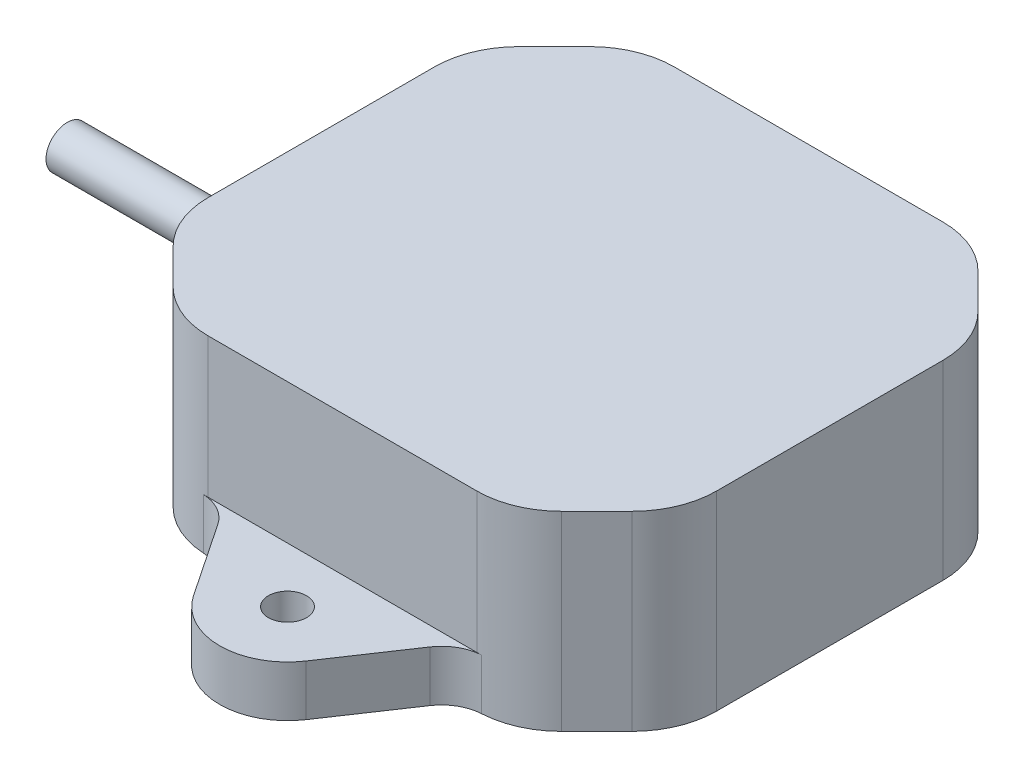
ISO-10303-21;
HEADER;
FILE_DESCRIPTION(('STEP AP214'),'2;1');
FILE_NAME('part.step','',(''),(''),'','','');
FILE_SCHEMA(('AUTOMOTIVE_DESIGN { 1 0 10303 214 1 1 1 1 }'));
ENDSEC;
DATA;
#1=APPLICATION_CONTEXT('core data for automotive mechanical design processes');
#2=APPLICATION_PROTOCOL_DEFINITION('international standard','automotive_design',2000,#1);
#3=PRODUCT_CONTEXT('',#1,'mechanical');
#4=PRODUCT('Part','Part','',(#3));
#5=PRODUCT_RELATED_PRODUCT_CATEGORY('part','',(#4));
#6=PRODUCT_DEFINITION_FORMATION('','',#4);
#7=PRODUCT_DEFINITION_CONTEXT('part definition',#1,'design');
#8=PRODUCT_DEFINITION('design','',#6,#7);
#9=PRODUCT_DEFINITION_SHAPE('','',#8);
#10=(LENGTH_UNIT() NAMED_UNIT(*) SI_UNIT(.MILLI.,.METRE.));
#11=(NAMED_UNIT(*) PLANE_ANGLE_UNIT() SI_UNIT($,.RADIAN.));
#12=(NAMED_UNIT(*) SI_UNIT($,.STERADIAN.) SOLID_ANGLE_UNIT());
#13=UNCERTAINTY_MEASURE_WITH_UNIT(LENGTH_MEASURE(1.E-05),#10,'distance_accuracy_value','');
#14=(GEOMETRIC_REPRESENTATION_CONTEXT(3) GLOBAL_UNCERTAINTY_ASSIGNED_CONTEXT((#13)) GLOBAL_UNIT_ASSIGNED_CONTEXT((#10,
#11,#12)) REPRESENTATION_CONTEXT('',''));
#15=CARTESIAN_POINT('',(0.,0.,0.));
#16=DIRECTION('',(0.,0.,1.));
#17=DIRECTION('',(1.,0.,0.));
#18=AXIS2_PLACEMENT_3D('',#15,#16,#17);
#19=CARTESIAN_POINT('',(-30.,11.25,27.5));
#20=DIRECTION('',(0.,0.,-1.));
#21=DIRECTION('',(-1.,0.,0.));
#22=AXIS2_PLACEMENT_3D('',#19,#20,#21);
#23=PLANE('',#22);
#24=DIRECTION('',(0.,1.,0.));
#25=VECTOR('',#24,1.);
#26=CARTESIAN_POINT('',(-15.857864376269,-11.25,27.5));
#27=LINE('',#26,#25);
#28=CARTESIAN_POINT('',(-15.857864376269,11.25,27.5));
#29=VERTEX_POINT('',#28);
#30=CARTESIAN_POINT('',(-15.857864376269,-5.25,27.5));
#31=VERTEX_POINT('',#30);
#32=EDGE_CURVE('E400',#29,#31,#27,.F.);
#33=ORIENTED_EDGE('',*,*,#32,.T.);
#34=DIRECTION('',(-1.,0.,0.));
#35=VECTOR('',#34,1.);
#36=CARTESIAN_POINT('',(-14.,-5.25,27.5));
#37=LINE('',#36,#35);
#38=CARTESIAN_POINT('',(15.857864376269,-5.25,27.5));
#39=VERTEX_POINT('',#38);
#40=EDGE_CURVE('E58',#39,#31,#37,.T.);
#41=ORIENTED_EDGE('',*,*,#40,.F.);
#42=DIRECTION('',(0.,1.,0.));
#43=VECTOR('',#42,1.);
#44=CARTESIAN_POINT('',(15.857864376269,11.25,27.5));
#45=LINE('',#44,#43);
#46=CARTESIAN_POINT('',(15.857864376269,11.25,27.5));
#47=VERTEX_POINT('',#46);
#48=EDGE_CURVE('E398',#39,#47,#45,.T.);
#49=ORIENTED_EDGE('',*,*,#48,.T.);
#50=DIRECTION('',(1.,0.,0.));
#51=VECTOR('',#50,1.);
#52=CARTESIAN_POINT('',(-30.,11.25,27.5));
#53=LINE('',#52,#51);
#54=EDGE_CURVE('E298',#29,#47,#53,.T.);
#55=ORIENTED_EDGE('',*,*,#54,.F.);
#56=EDGE_LOOP('',(#33,#41,#49,#55));
#57=FACE_BOUND('',#56,.T.);
#58=ADVANCED_FACE('F43',(#57),#23,.F.);
#59=CARTESIAN_POINT('',(-30.,11.25,-27.5));
#60=DIRECTION('',(1.,0.,0.));
#61=DIRECTION('',(0.,0.,-1.));
#62=AXIS2_PLACEMENT_3D('',#59,#60,#61);
#63=PLANE('',#62);
#64=CARTESIAN_POINT('',(-30.,-5.25,0.));
#65=DIRECTION('',(1.,0.,0.));
#66=DIRECTION('',(0.,0.,-1.));
#67=AXIS2_PLACEMENT_3D('',#64,#65,#66);
#68=CIRCLE('',#67,2.5);
#69=CARTESIAN_POINT('',(-30.,-5.25,-2.5));
#70=VERTEX_POINT('',#69);
#71=EDGE_CURVE('E11',#70,#70,#68,.F.);
#72=ORIENTED_EDGE('',*,*,#71,.F.);
#73=EDGE_LOOP('',(#72));
#74=FACE_BOUND('',#73,.T.);
#75=DIRECTION('',(0.,0.,1.));
#76=VECTOR('',#75,1.);
#77=CARTESIAN_POINT('',(-30.,11.25,-27.5));
#78=LINE('',#77,#76);
#79=CARTESIAN_POINT('',(-30.,11.25,-13.357864376269));
#80=VERTEX_POINT('',#79);
#81=CARTESIAN_POINT('',(-30.,11.25,13.357864376269));
#82=VERTEX_POINT('',#81);
#83=EDGE_CURVE('E295',#80,#82,#78,.T.);
#84=ORIENTED_EDGE('',*,*,#83,.F.);
#85=DIRECTION('',(0.,-1.,0.));
#86=VECTOR('',#85,1.);
#87=CARTESIAN_POINT('',(-30.,-11.25,-13.357864376269));
#88=LINE('',#87,#86);
#89=CARTESIAN_POINT('',(-30.,-11.25,-13.357864376269));
#90=VERTEX_POINT('',#89);
#91=EDGE_CURVE('E391',#80,#90,#88,.T.);
#92=ORIENTED_EDGE('',*,*,#91,.T.);
#93=DIRECTION('',(0.,0.,1.));
#94=VECTOR('',#93,1.);
#95=CARTESIAN_POINT('',(-30.,-11.25,-27.5));
#96=LINE('',#95,#94);
#97=CARTESIAN_POINT('',(-30.,-11.25,13.357864376269));
#98=VERTEX_POINT('',#97);
#99=EDGE_CURVE('E292',#90,#98,#96,.T.);
#100=ORIENTED_EDGE('',*,*,#99,.T.);
#101=DIRECTION('',(0.,-1.,0.));
#102=VECTOR('',#101,1.);
#103=CARTESIAN_POINT('',(-30.,11.25,13.357864376269));
#104=LINE('',#103,#102);
#105=EDGE_CURVE('E388',#98,#82,#104,.F.);
#106=ORIENTED_EDGE('',*,*,#105,.T.);
#107=EDGE_LOOP('',(#84,#92,#100,#106));
#108=FACE_BOUND('',#107,.T.);
#109=ADVANCED_FACE('F513',(#74,#108),#63,.F.);
#110=CARTESIAN_POINT('',(30.,11.25,-27.5));
#111=DIRECTION('',(1.,0.,0.));
#112=DIRECTION('',(0.,0.,-1.));
#113=AXIS2_PLACEMENT_3D('',#110,#111,#112);
#114=PLANE('',#113);
#115=DIRECTION('',(0.,0.,1.));
#116=VECTOR('',#115,1.);
#117=CARTESIAN_POINT('',(30.,-11.25,-27.5));
#118=LINE('',#117,#116);
#119=CARTESIAN_POINT('',(30.,-11.25,-13.357864376269));
#120=VERTEX_POINT('',#119);
#121=CARTESIAN_POINT('',(30.,-11.25,13.357864376269));
#122=VERTEX_POINT('',#121);
#123=EDGE_CURVE('E299',#120,#122,#118,.T.);
#124=ORIENTED_EDGE('',*,*,#123,.F.);
#125=DIRECTION('',(0.,-1.,0.));
#126=VECTOR('',#125,1.);
#127=CARTESIAN_POINT('',(30.,11.25,-13.357864376269));
#128=LINE('',#127,#126);
#129=CARTESIAN_POINT('',(30.,11.25,-13.357864376269));
#130=VERTEX_POINT('',#129);
#131=EDGE_CURVE('E339',#120,#130,#128,.F.);
#132=ORIENTED_EDGE('',*,*,#131,.T.);
#133=DIRECTION('',(0.,0.,1.));
#134=VECTOR('',#133,1.);
#135=CARTESIAN_POINT('',(30.,11.25,-27.5));
#136=LINE('',#135,#134);
#137=CARTESIAN_POINT('',(30.,11.25,13.357864376269));
#138=VERTEX_POINT('',#137);
#139=EDGE_CURVE('E302',#130,#138,#136,.T.);
#140=ORIENTED_EDGE('',*,*,#139,.T.);
#141=DIRECTION('',(0.,-1.,0.));
#142=VECTOR('',#141,1.);
#143=CARTESIAN_POINT('',(30.,11.25,13.357864376269));
#144=LINE('',#143,#142);
#145=EDGE_CURVE('E336',#138,#122,#144,.T.);
#146=ORIENTED_EDGE('',*,*,#145,.T.);
#147=EDGE_LOOP('',(#124,#132,#140,#146));
#148=FACE_BOUND('',#147,.T.);
#149=ADVANCED_FACE('F477',(#148),#114,.T.);
#150=CARTESIAN_POINT('',(-30.,11.25,-27.5));
#151=DIRECTION('',(0.,0.,-1.));
#152=DIRECTION('',(-1.,0.,0.));
#153=AXIS2_PLACEMENT_3D('',#150,#151,#152);
#154=PLANE('',#153);
#155=DIRECTION('',(0.,1.,0.));
#156=VECTOR('',#155,1.);
#157=CARTESIAN_POINT('',(15.857864376269,11.25,-27.5));
#158=LINE('',#157,#156);
#159=CARTESIAN_POINT('',(15.857864376269,11.25,-27.5));
#160=VERTEX_POINT('',#159);
#161=CARTESIAN_POINT('',(15.857864376269,-5.25,-27.5));
#162=VERTEX_POINT('',#161);
#163=EDGE_CURVE('E382',#160,#162,#158,.F.);
#164=ORIENTED_EDGE('',*,*,#163,.T.);
#165=DIRECTION('',(-1.,0.,0.));
#166=VECTOR('',#165,1.);
#167=CARTESIAN_POINT('',(-14.,-5.25,-27.5));
#168=LINE('',#167,#166);
#169=CARTESIAN_POINT('',(-15.857864376269,-5.25,-27.5));
#170=VERTEX_POINT('',#169);
#171=EDGE_CURVE('E66',#162,#170,#168,.T.);
#172=ORIENTED_EDGE('',*,*,#171,.T.);
#173=DIRECTION('',(0.,1.,0.));
#174=VECTOR('',#173,1.);
#175=CARTESIAN_POINT('',(-15.857864376269,11.25,-27.5));
#176=LINE('',#175,#174);
#177=CARTESIAN_POINT('',(-15.857864376269,11.25,-27.5));
#178=VERTEX_POINT('',#177);
#179=EDGE_CURVE('E380',#170,#178,#176,.T.);
#180=ORIENTED_EDGE('',*,*,#179,.T.);
#181=DIRECTION('',(1.,0.,0.));
#182=VECTOR('',#181,1.);
#183=CARTESIAN_POINT('',(-30.,11.25,-27.5));
#184=LINE('',#183,#182);
#185=EDGE_CURVE('E305',#178,#160,#184,.T.);
#186=ORIENTED_EDGE('',*,*,#185,.T.);
#187=EDGE_LOOP('',(#164,#172,#180,#186));
#188=FACE_BOUND('',#187,.T.);
#189=ADVANCED_FACE('F495',(#188),#154,.T.);
#190=CARTESIAN_POINT('',(0.,11.25,0.));
#191=DIRECTION('',(0.,1.,0.));
#192=DIRECTION('',(0.,0.,1.));
#193=AXIS2_PLACEMENT_3D('',#190,#191,#192);
#194=PLANE('',#193);
#195=ORIENTED_EDGE('',*,*,#139,.F.);
#196=CARTESIAN_POINT('',(20.,11.25,-13.357864376269));
#197=DIRECTION('',(0.,1.,0.));
#198=DIRECTION('',(0.,0.,1.));
#199=AXIS2_PLACEMENT_3D('',#196,#197,#198);
#200=CIRCLE('',#199,10.);
#201=CARTESIAN_POINT('',(27.0710678118655,11.25,-20.4289321881345));
#202=VERTEX_POINT('',#201);
#203=EDGE_CURVE('E356',#130,#202,#200,.T.);
#204=ORIENTED_EDGE('',*,*,#203,.T.);
#205=DIRECTION('',(0.707106781186547,0.,0.707106781186548));
#206=VECTOR('',#205,1.);
#207=CARTESIAN_POINT('',(23.75,11.25,-23.75));
#208=LINE('',#207,#206);
#209=CARTESIAN_POINT('',(22.9289321881345,11.25,-24.5710678118655));
#210=VERTEX_POINT('',#209);
#211=EDGE_CURVE('E327',#202,#210,#208,.F.);
#212=ORIENTED_EDGE('',*,*,#211,.T.);
#213=CARTESIAN_POINT('',(15.857864376269,11.25,-17.5));
#214=DIRECTION('',(0.,1.,0.));
#215=DIRECTION('',(0.,0.,1.));
#216=AXIS2_PLACEMENT_3D('',#213,#214,#215);
#217=CIRCLE('',#216,10.);
#218=EDGE_CURVE('E354',#210,#160,#217,.T.);
#219=ORIENTED_EDGE('',*,*,#218,.T.);
#220=ORIENTED_EDGE('',*,*,#185,.F.);
#221=CARTESIAN_POINT('',(-15.857864376269,11.25,-17.5));
#222=DIRECTION('',(0.,1.,0.));
#223=DIRECTION('',(0.,0.,1.));
#224=AXIS2_PLACEMENT_3D('',#221,#222,#223);
#225=CIRCLE('',#224,10.);
#226=CARTESIAN_POINT('',(-22.9289321881345,11.25,-24.5710678118655));
#227=VERTEX_POINT('',#226);
#228=EDGE_CURVE('E352',#178,#227,#225,.T.);
#229=ORIENTED_EDGE('',*,*,#228,.T.);
#230=DIRECTION('',(-0.707106781186549,0.,0.707106781186546));
#231=VECTOR('',#230,1.);
#232=CARTESIAN_POINT('',(-23.7499999999999,11.25,-23.75));
#233=LINE('',#232,#231);
#234=CARTESIAN_POINT('',(-27.0710678118655,11.25,-20.4289321881345));
#235=VERTEX_POINT('',#234);
#236=EDGE_CURVE('E324',#227,#235,#233,.T.);
#237=ORIENTED_EDGE('',*,*,#236,.T.);
#238=CARTESIAN_POINT('',(-20.,11.25,-13.357864376269));
#239=DIRECTION('',(0.,1.,0.));
#240=DIRECTION('',(0.,0.,1.));
#241=AXIS2_PLACEMENT_3D('',#238,#239,#240);
#242=CIRCLE('',#241,10.);
#243=EDGE_CURVE('E350',#235,#80,#242,.T.);
#244=ORIENTED_EDGE('',*,*,#243,.T.);
#245=ORIENTED_EDGE('',*,*,#83,.T.);
#246=CARTESIAN_POINT('',(-20.,11.25,13.357864376269));
#247=DIRECTION('',(0.,1.,0.));
#248=DIRECTION('',(0.,0.,1.));
#249=AXIS2_PLACEMENT_3D('',#246,#247,#248);
#250=CIRCLE('',#249,10.);
#251=CARTESIAN_POINT('',(-27.0710678118655,11.25,20.4289321881345));
#252=VERTEX_POINT('',#251);
#253=EDGE_CURVE('E348',#82,#252,#250,.T.);
#254=ORIENTED_EDGE('',*,*,#253,.T.);
#255=DIRECTION('',(-0.707106781186546,0.,-0.707106781186549));
#256=VECTOR('',#255,1.);
#257=CARTESIAN_POINT('',(-23.75,11.25,23.7499999999999));
#258=LINE('',#257,#256);
#259=CARTESIAN_POINT('',(-22.9289321881345,11.25,24.5710678118655));
#260=VERTEX_POINT('',#259);
#261=EDGE_CURVE('E333',#252,#260,#258,.F.);
#262=ORIENTED_EDGE('',*,*,#261,.T.);
#263=CARTESIAN_POINT('',(-15.857864376269,11.25,17.5));
#264=DIRECTION('',(0.,1.,0.));
#265=DIRECTION('',(0.,0.,1.));
#266=AXIS2_PLACEMENT_3D('',#263,#264,#265);
#267=CIRCLE('',#266,10.);
#268=EDGE_CURVE('E346',#260,#29,#267,.T.);
#269=ORIENTED_EDGE('',*,*,#268,.T.);
#270=ORIENTED_EDGE('',*,*,#54,.T.);
#271=CARTESIAN_POINT('',(15.857864376269,11.25,17.5));
#272=DIRECTION('',(0.,1.,0.));
#273=DIRECTION('',(0.,0.,1.));
#274=AXIS2_PLACEMENT_3D('',#271,#272,#273);
#275=CIRCLE('',#274,10.);
#276=CARTESIAN_POINT('',(22.9289321881345,11.25,24.5710678118655));
#277=VERTEX_POINT('',#276);
#278=EDGE_CURVE('E342',#47,#277,#275,.T.);
#279=ORIENTED_EDGE('',*,*,#278,.T.);
#280=DIRECTION('',(0.707106781186549,0.,-0.707106781186546));
#281=VECTOR('',#280,1.);
#282=CARTESIAN_POINT('',(23.75,11.25,23.75));
#283=LINE('',#282,#281);
#284=CARTESIAN_POINT('',(27.0710678118655,11.25,20.4289321881345));
#285=VERTEX_POINT('',#284);
#286=EDGE_CURVE('E330',#277,#285,#283,.T.);
#287=ORIENTED_EDGE('',*,*,#286,.T.);
#288=CARTESIAN_POINT('',(20.,11.25,13.357864376269));
#289=DIRECTION('',(0.,1.,0.));
#290=DIRECTION('',(0.,0.,1.));
#291=AXIS2_PLACEMENT_3D('',#288,#289,#290);
#292=CIRCLE('',#291,10.);
#293=EDGE_CURVE('E344',#285,#138,#292,.T.);
#294=ORIENTED_EDGE('',*,*,#293,.T.);
#295=EDGE_LOOP('',(#195,#204,#212,#219,#220,#229,#237,#244,#245,#254,#262,#269,#270,#279,#287,#294));
#296=FACE_BOUND('',#295,.T.);
#297=ADVANCED_FACE('F471',(#296),#194,.T.);
#298=CARTESIAN_POINT('',(0.,-11.25,0.));
#299=DIRECTION('',(0.,1.,0.));
#300=DIRECTION('',(0.,0.,1.));
#301=AXIS2_PLACEMENT_3D('',#298,#299,#300);
#302=PLANE('',#301);
#303=DIRECTION('',(-0.707106781186547,0.,-0.707106781186548));
#304=VECTOR('',#303,1.);
#305=CARTESIAN_POINT('',(20.,-11.25,-27.5));
#306=LINE('',#305,#304);
#307=CARTESIAN_POINT('',(22.9289321881345,-11.25,-24.5710678118655));
#308=VERTEX_POINT('',#307);
#309=CARTESIAN_POINT('',(27.0710678118655,-11.25,-20.4289321881345));
#310=VERTEX_POINT('',#309);
#311=EDGE_CURVE('E315',#308,#310,#306,.F.);
#312=ORIENTED_EDGE('',*,*,#311,.T.);
#313=CARTESIAN_POINT('',(20.,-11.25,-13.357864376269));
#314=DIRECTION('',(0.,1.,0.));
#315=DIRECTION('',(0.,0.,1.));
#316=AXIS2_PLACEMENT_3D('',#313,#314,#315);
#317=CIRCLE('',#316,10.);
#318=EDGE_CURVE('E378',#310,#120,#317,.F.);
#319=ORIENTED_EDGE('',*,*,#318,.T.);
#320=ORIENTED_EDGE('',*,*,#123,.T.);
#321=CARTESIAN_POINT('',(20.,-11.25,13.357864376269));
#322=DIRECTION('',(0.,1.,0.));
#323=DIRECTION('',(0.,0.,1.));
#324=AXIS2_PLACEMENT_3D('',#321,#322,#323);
#325=CIRCLE('',#324,10.);
#326=CARTESIAN_POINT('',(27.0710678118655,-11.25,20.4289321881345));
#327=VERTEX_POINT('',#326);
#328=EDGE_CURVE('E365',#122,#327,#325,.F.);
#329=ORIENTED_EDGE('',*,*,#328,.T.);
#330=DIRECTION('',(-0.707106781186549,0.,0.707106781186546));
#331=VECTOR('',#330,1.);
#332=CARTESIAN_POINT('',(30.,-11.25,17.5));
#333=LINE('',#332,#331);
#334=CARTESIAN_POINT('',(22.9289321881345,-11.25,24.5710678118655));
#335=VERTEX_POINT('',#334);
#336=EDGE_CURVE('E318',#327,#335,#333,.T.);
#337=ORIENTED_EDGE('',*,*,#336,.T.);
#338=CARTESIAN_POINT('',(15.857864376269,-11.25,17.5));
#339=DIRECTION('',(0.,1.,0.));
#340=DIRECTION('',(0.,0.,1.));
#341=AXIS2_PLACEMENT_3D('',#338,#339,#340);
#342=CIRCLE('',#341,10.);
#343=CARTESIAN_POINT('',(16.4063301763717,-11.25,27.484947935073));
#344=VERTEX_POINT('',#343);
#345=EDGE_CURVE('E362',#335,#344,#342,.F.);
#346=ORIENTED_EDGE('',*,*,#345,.T.);
#347=CARTESIAN_POINT('',(16.680563076423,-11.25,32.4774219026094));
#348=DIRECTION('',(0.,1.,0.));
#349=DIRECTION('',(0.,0.,1.));
#350=AXIS2_PLACEMENT_3D('',#347,#348,#349);
#351=CIRCLE('',#350,5.);
#352=CARTESIAN_POINT('',(12.5294096223645,-11.25,29.6903221554066));
#353=VERTEX_POINT('',#352);
#354=EDGE_CURVE('E451',#344,#353,#351,.T.);
#355=ORIENTED_EDGE('',*,*,#354,.T.);
#356=DIRECTION('',(0.557419949440575,0.,-0.830230690811697));
#357=VECTOR('',#356,1.);
#358=CARTESIAN_POINT('',(6.64184552649357,-11.25,38.4593595955246));
#359=LINE('',#358,#357);
#360=CARTESIAN_POINT('',(6.64184552649357,-11.25,38.4593595955246));
#361=VERTEX_POINT('',#360);
#362=EDGE_CURVE('E260',#361,#353,#359,.T.);
#363=ORIENTED_EDGE('',*,*,#362,.F.);
#364=CARTESIAN_POINT('',(0.,-11.25,34.));
#365=DIRECTION('',(0.,1.,0.));
#366=DIRECTION('',(0.,0.,1.));
#367=AXIS2_PLACEMENT_3D('',#364,#365,#366);
#368=CIRCLE('',#367,8.);
#369=CARTESIAN_POINT('',(-6.64184552649357,-11.25,38.4593595955246));
#370=VERTEX_POINT('',#369);
#371=EDGE_CURVE('E245',#370,#361,#368,.T.);
#372=ORIENTED_EDGE('',*,*,#371,.F.);
#373=DIRECTION('',(0.557419949440575,0.,0.830230690811696));
#374=VECTOR('',#373,1.);
#375=CARTESIAN_POINT('',(-14.,-11.25,27.5));
#376=LINE('',#375,#374);
#377=CARTESIAN_POINT('',(-12.5294096223646,-11.25,29.6903221554066));
#378=VERTEX_POINT('',#377);
#379=EDGE_CURVE('E255',#378,#370,#376,.T.);
#380=ORIENTED_EDGE('',*,*,#379,.F.);
#381=CARTESIAN_POINT('',(-16.680563076423,-11.25,32.4774219026094));
#382=DIRECTION('',(0.,1.,0.));
#383=DIRECTION('',(0.,0.,1.));
#384=AXIS2_PLACEMENT_3D('',#381,#382,#383);
#385=CIRCLE('',#384,5.);
#386=CARTESIAN_POINT('',(-16.4063301763717,-11.25,27.484947935073));
#387=VERTEX_POINT('',#386);
#388=EDGE_CURVE('E447',#378,#387,#385,.T.);
#389=ORIENTED_EDGE('',*,*,#388,.T.);
#390=CARTESIAN_POINT('',(-15.857864376269,-11.25,17.5));
#391=DIRECTION('',(0.,1.,0.));
#392=DIRECTION('',(0.,0.,1.));
#393=AXIS2_PLACEMENT_3D('',#390,#391,#392);
#394=CIRCLE('',#393,10.);
#395=CARTESIAN_POINT('',(-22.9289321881345,-11.25,24.5710678118655));
#396=VERTEX_POINT('',#395);
#397=EDGE_CURVE('E367',#387,#396,#394,.F.);
#398=ORIENTED_EDGE('',*,*,#397,.T.);
#399=DIRECTION('',(0.707106781186546,0.,0.707106781186549));
#400=VECTOR('',#399,1.);
#401=CARTESIAN_POINT('',(-20.,-11.25,27.5));
#402=LINE('',#401,#400);
#403=CARTESIAN_POINT('',(-27.0710678118655,-11.25,20.4289321881345));
#404=VERTEX_POINT('',#403);
#405=EDGE_CURVE('E321',#396,#404,#402,.F.);
#406=ORIENTED_EDGE('',*,*,#405,.T.);
#407=CARTESIAN_POINT('',(-20.,-11.25,13.357864376269));
#408=DIRECTION('',(0.,1.,0.));
#409=DIRECTION('',(0.,0.,1.));
#410=AXIS2_PLACEMENT_3D('',#407,#408,#409);
#411=CIRCLE('',#410,10.);
#412=EDGE_CURVE('E369',#404,#98,#411,.F.);
#413=ORIENTED_EDGE('',*,*,#412,.T.);
#414=ORIENTED_EDGE('',*,*,#99,.F.);
#415=CARTESIAN_POINT('',(-20.,-11.25,-13.357864376269));
#416=DIRECTION('',(0.,1.,0.));
#417=DIRECTION('',(0.,0.,1.));
#418=AXIS2_PLACEMENT_3D('',#415,#416,#417);
#419=CIRCLE('',#418,10.);
#420=CARTESIAN_POINT('',(-27.0710678118655,-11.25,-20.4289321881345));
#421=VERTEX_POINT('',#420);
#422=EDGE_CURVE('E371',#90,#421,#419,.F.);
#423=ORIENTED_EDGE('',*,*,#422,.T.);
#424=DIRECTION('',(0.707106781186549,0.,-0.707106781186546));
#425=VECTOR('',#424,1.);
#426=CARTESIAN_POINT('',(-30.,-11.25,-17.5));
#427=LINE('',#426,#425);
#428=CARTESIAN_POINT('',(-22.9289321881345,-11.25,-24.5710678118655));
#429=VERTEX_POINT('',#428);
#430=EDGE_CURVE('E308',#421,#429,#427,.T.);
#431=ORIENTED_EDGE('',*,*,#430,.T.);
#432=CARTESIAN_POINT('',(-15.857864376269,-11.25,-17.5));
#433=DIRECTION('',(0.,1.,0.));
#434=DIRECTION('',(0.,0.,1.));
#435=AXIS2_PLACEMENT_3D('',#432,#433,#434);
#436=CIRCLE('',#435,10.);
#437=CARTESIAN_POINT('',(-16.4063301763717,-11.25,-27.484947935073));
#438=VERTEX_POINT('',#437);
#439=EDGE_CURVE('E373',#429,#438,#436,.F.);
#440=ORIENTED_EDGE('',*,*,#439,.T.);
#441=CARTESIAN_POINT('',(-16.680563076423,-11.25,-32.4774219026094));
#442=DIRECTION('',(0.,1.,0.));
#443=DIRECTION('',(0.,0.,1.));
#444=AXIS2_PLACEMENT_3D('',#441,#442,#443);
#445=CIRCLE('',#444,5.);
#446=CARTESIAN_POINT('',(-12.5294096223646,-11.25,-29.6903221554066));
#447=VERTEX_POINT('',#446);
#448=EDGE_CURVE('E443',#438,#447,#445,.T.);
#449=ORIENTED_EDGE('',*,*,#448,.T.);
#450=DIRECTION('',(0.557419949440575,0.,-0.830230690811696));
#451=VECTOR('',#450,1.);
#452=CARTESIAN_POINT('',(-14.,-11.25,-27.5));
#453=LINE('',#452,#451);
#454=CARTESIAN_POINT('',(-6.64184552649357,-11.25,-38.4593595955246));
#455=VERTEX_POINT('',#454);
#456=EDGE_CURVE('E270',#447,#455,#453,.T.);
#457=ORIENTED_EDGE('',*,*,#456,.T.);
#458=CARTESIAN_POINT('',(0.,-11.25,-34.));
#459=DIRECTION('',(0.,-1.,0.));
#460=DIRECTION('',(0.,0.,-1.));
#461=AXIS2_PLACEMENT_3D('',#458,#459,#460);
#462=CIRCLE('',#461,8.);
#463=CARTESIAN_POINT('',(6.64184552649357,-11.25,-38.4593595955246));
#464=VERTEX_POINT('',#463);
#465=EDGE_CURVE('E285',#455,#464,#462,.T.);
#466=ORIENTED_EDGE('',*,*,#465,.T.);
#467=DIRECTION('',(0.557419949440575,0.,0.830230690811697));
#468=VECTOR('',#467,1.);
#469=CARTESIAN_POINT('',(6.64184552649357,-11.25,-38.4593595955246));
#470=LINE('',#469,#468);
#471=CARTESIAN_POINT('',(12.5294096223646,-11.25,-29.6903221554066));
#472=VERTEX_POINT('',#471);
#473=EDGE_CURVE('E275',#464,#472,#470,.T.);
#474=ORIENTED_EDGE('',*,*,#473,.T.);
#475=CARTESIAN_POINT('',(16.680563076423,-11.25,-32.4774219026094));
#476=DIRECTION('',(0.,1.,0.));
#477=DIRECTION('',(0.,0.,1.));
#478=AXIS2_PLACEMENT_3D('',#475,#476,#477);
#479=CIRCLE('',#478,5.);
#480=CARTESIAN_POINT('',(16.4063301763717,-11.25,-27.484947935073));
#481=VERTEX_POINT('',#480);
#482=EDGE_CURVE('E439',#472,#481,#479,.T.);
#483=ORIENTED_EDGE('',*,*,#482,.T.);
#484=CARTESIAN_POINT('',(15.857864376269,-11.25,-17.5));
#485=DIRECTION('',(0.,1.,0.));
#486=DIRECTION('',(0.,0.,1.));
#487=AXIS2_PLACEMENT_3D('',#484,#485,#486);
#488=CIRCLE('',#487,10.);
#489=EDGE_CURVE('E376',#481,#308,#488,.F.);
#490=ORIENTED_EDGE('',*,*,#489,.T.);
#491=EDGE_LOOP('',(#312,#319,#320,#329,#337,#346,#355,#363,#372,#380,#389,#398,#406,#413,#414,
#423,#431,#440,#449,#457,#466,#474,#483,#490));
#492=FACE_BOUND('',#491,.T.);
#493=CARTESIAN_POINT('',(0.,-11.25,-34.));
#494=DIRECTION('',(0.,-1.,0.));
#495=DIRECTION('',(0.,0.,-1.));
#496=AXIS2_PLACEMENT_3D('',#493,#494,#495);
#497=CIRCLE('',#496,2.25);
#498=CARTESIAN_POINT('',(0.,-11.25,-36.25));
#499=VERTEX_POINT('',#498);
#500=EDGE_CURVE('E265',#499,#499,#497,.T.);
#501=ORIENTED_EDGE('',*,*,#500,.F.);
#502=EDGE_LOOP('',(#501));
#503=FACE_BOUND('',#502,.T.);
#504=CARTESIAN_POINT('',(0.,-11.25,34.));
#505=DIRECTION('',(0.,1.,0.));
#506=DIRECTION('',(0.,0.,1.));
#507=AXIS2_PLACEMENT_3D('',#504,#505,#506);
#508=CIRCLE('',#507,2.25);
#509=CARTESIAN_POINT('',(0.,-11.25,36.25));
#510=VERTEX_POINT('',#509);
#511=EDGE_CURVE('E794',#510,#510,#508,.T.);
#512=ORIENTED_EDGE('',*,*,#511,.T.);
#513=EDGE_LOOP('',(#512));
#514=FACE_BOUND('',#513,.T.);
#515=ADVANCED_FACE('F460',(#492,#503,#514),#302,.F.);
#516=CARTESIAN_POINT('',(6.64184552649357,-5.25,-38.4593595955246));
#517=DIRECTION('',(0.830230690811697,0.,-0.557419949440575));
#518=DIRECTION('',(-0.557419949440575,0.,-0.830230690811697));
#519=AXIS2_PLACEMENT_3D('',#516,#517,#518);
#520=PLANE('',#519);
#521=DIRECTION('',(0.557419949440575,0.,0.830230690811697));
#522=VECTOR('',#521,1.);
#523=CARTESIAN_POINT('',(6.64184552649357,-5.25,-38.4593595955246));
#524=LINE('',#523,#522);
#525=CARTESIAN_POINT('',(6.64184552649357,-5.25,-38.4593595955246));
#526=VERTEX_POINT('',#525);
#527=CARTESIAN_POINT('',(12.5294096223646,-5.25,-29.6903221554066));
#528=VERTEX_POINT('',#527);
#529=EDGE_CURVE('E280',#526,#528,#524,.T.);
#530=ORIENTED_EDGE('',*,*,#529,.T.);
#531=DIRECTION('',(0.,-1.,0.));
#532=VECTOR('',#531,1.);
#533=CARTESIAN_POINT('',(12.5294096223646,-11.25,-29.6903221554066));
#534=LINE('',#533,#532);
#535=EDGE_CURVE('E406',#528,#472,#534,.T.);
#536=ORIENTED_EDGE('',*,*,#535,.T.);
#537=ORIENTED_EDGE('',*,*,#473,.F.);
#538=DIRECTION('',(0.,-1.,0.));
#539=VECTOR('',#538,1.);
#540=CARTESIAN_POINT('',(6.64184552649357,-5.25,-38.4593595955246));
#541=LINE('',#540,#539);
#542=EDGE_CURVE('E290',#526,#464,#541,.T.);
#543=ORIENTED_EDGE('',*,*,#542,.F.);
#544=EDGE_LOOP('',(#530,#536,#537,#543));
#545=FACE_BOUND('',#544,.T.);
#546=ADVANCED_FACE('F613',(#545),#520,.T.);
#547=CARTESIAN_POINT('',(0.,-5.25,-34.));
#548=DIRECTION('',(0.,-1.,0.));
#549=DIRECTION('',(0.,0.,-1.));
#550=AXIS2_PLACEMENT_3D('',#547,#548,#549);
#551=CYLINDRICAL_SURFACE('',#550,8.);
#552=ORIENTED_EDGE('',*,*,#465,.F.);
#553=DIRECTION('',(0.,-1.,0.));
#554=VECTOR('',#553,1.);
#555=CARTESIAN_POINT('',(-6.64184552649357,-5.25,-38.4593595955246));
#556=LINE('',#555,#554);
#557=CARTESIAN_POINT('',(-6.64184552649357,-5.25,-38.4593595955246));
#558=VERTEX_POINT('',#557);
#559=EDGE_CURVE('E283',#558,#455,#556,.T.);
#560=ORIENTED_EDGE('',*,*,#559,.F.);
#561=CARTESIAN_POINT('',(0.,-5.25,-34.));
#562=DIRECTION('',(0.,-1.,0.));
#563=DIRECTION('',(0.,0.,-1.));
#564=AXIS2_PLACEMENT_3D('',#561,#562,#563);
#565=CIRCLE('',#564,8.);
#566=EDGE_CURVE('E277',#558,#526,#565,.T.);
#567=ORIENTED_EDGE('',*,*,#566,.T.);
#568=ORIENTED_EDGE('',*,*,#542,.T.);
#569=EDGE_LOOP('',(#552,#560,#567,#568));
#570=FACE_BOUND('',#569,.T.);
#571=ADVANCED_FACE('F610',(#570),#551,.T.);
#572=CARTESIAN_POINT('',(-14.,-5.25,-27.5));
#573=DIRECTION('',(-0.830230690811696,0.,-0.557419949440575));
#574=DIRECTION('',(-0.557419949440575,0.,0.830230690811696));
#575=AXIS2_PLACEMENT_3D('',#572,#573,#574);
#576=PLANE('',#575);
#577=ORIENTED_EDGE('',*,*,#456,.F.);
#578=DIRECTION('',(0.,-1.,0.));
#579=VECTOR('',#578,1.);
#580=CARTESIAN_POINT('',(-12.5294096223646,-5.25,-29.6903221554066));
#581=LINE('',#580,#579);
#582=CARTESIAN_POINT('',(-12.5294096223646,-5.25,-29.6903221554066));
#583=VERTEX_POINT('',#582);
#584=EDGE_CURVE('E421',#447,#583,#581,.F.);
#585=ORIENTED_EDGE('',*,*,#584,.T.);
#586=DIRECTION('',(0.557419949440575,0.,-0.830230690811696));
#587=VECTOR('',#586,1.);
#588=CARTESIAN_POINT('',(-14.,-5.25,-27.5));
#589=LINE('',#588,#587);
#590=EDGE_CURVE('E274',#583,#558,#589,.T.);
#591=ORIENTED_EDGE('',*,*,#590,.T.);
#592=ORIENTED_EDGE('',*,*,#559,.T.);
#593=EDGE_LOOP('',(#577,#585,#591,#592));
#594=FACE_BOUND('',#593,.T.);
#595=ADVANCED_FACE('F604',(#594),#576,.T.);
#596=CARTESIAN_POINT('',(0.,-5.25,-34.));
#597=DIRECTION('',(0.,-1.,0.));
#598=DIRECTION('',(0.,0.,-1.));
#599=AXIS2_PLACEMENT_3D('',#596,#597,#598);
#600=PLANE('',#599);
#601=CARTESIAN_POINT('',(0.,-5.25,-34.));
#602=DIRECTION('',(0.,-1.,0.));
#603=DIRECTION('',(0.,0.,-1.));
#604=AXIS2_PLACEMENT_3D('',#601,#602,#603);
#605=CIRCLE('',#604,2.25);
#606=CARTESIAN_POINT('',(0.,-5.25,-36.25));
#607=VERTEX_POINT('',#606);
#608=EDGE_CURVE('E267',#607,#607,#605,.T.);
#609=ORIENTED_EDGE('',*,*,#608,.T.);
#610=EDGE_LOOP('',(#609));
#611=FACE_BOUND('',#610,.T.);
#612=ORIENTED_EDGE('',*,*,#171,.F.);
#613=CARTESIAN_POINT('',(15.857864376269,-5.25,-17.5));
#614=DIRECTION('',(0.,-1.,0.));
#615=DIRECTION('',(0.,0.,-1.));
#616=AXIS2_PLACEMENT_3D('',#613,#614,#615);
#617=CIRCLE('',#616,10.);
#618=CARTESIAN_POINT('',(16.4063301763717,-5.25,-27.484947935073));
#619=VERTEX_POINT('',#618);
#620=EDGE_CURVE('E409',#619,#162,#617,.F.);
#621=ORIENTED_EDGE('',*,*,#620,.F.);
#622=CARTESIAN_POINT('',(16.680563076423,-5.25,-32.4774219026094));
#623=DIRECTION('',(0.,-1.,0.));
#624=DIRECTION('',(0.,0.,-1.));
#625=AXIS2_PLACEMENT_3D('',#622,#623,#624);
#626=CIRCLE('',#625,5.);
#627=EDGE_CURVE('E441',#619,#528,#626,.T.);
#628=ORIENTED_EDGE('',*,*,#627,.T.);
#629=ORIENTED_EDGE('',*,*,#529,.F.);
#630=ORIENTED_EDGE('',*,*,#566,.F.);
#631=ORIENTED_EDGE('',*,*,#590,.F.);
#632=CARTESIAN_POINT('',(-16.680563076423,-5.25,-32.4774219026094));
#633=DIRECTION('',(0.,-1.,0.));
#634=DIRECTION('',(0.,0.,-1.));
#635=AXIS2_PLACEMENT_3D('',#632,#633,#634);
#636=CIRCLE('',#635,5.);
#637=CARTESIAN_POINT('',(-16.4063301763717,-5.25,-27.484947935073));
#638=VERTEX_POINT('',#637);
#639=EDGE_CURVE('E445',#583,#638,#636,.T.);
#640=ORIENTED_EDGE('',*,*,#639,.T.);
#641=CARTESIAN_POINT('',(-15.857864376269,-5.25,-17.5));
#642=DIRECTION('',(0.,-1.,0.));
#643=DIRECTION('',(0.,0.,-1.));
#644=AXIS2_PLACEMENT_3D('',#641,#642,#643);
#645=CIRCLE('',#644,10.);
#646=EDGE_CURVE('E415',#170,#638,#645,.F.);
#647=ORIENTED_EDGE('',*,*,#646,.F.);
#648=EDGE_LOOP('',(#612,#621,#628,#629,#630,#631,#640,#647));
#649=FACE_BOUND('',#648,.T.);
#650=ADVANCED_FACE('F618',(#611,#649),#600,.F.);
#651=CARTESIAN_POINT('',(0.,-5.25,-34.));
#652=DIRECTION('',(0.,-1.,0.));
#653=DIRECTION('',(0.,0.,-1.));
#654=AXIS2_PLACEMENT_3D('',#651,#652,#653);
#655=CYLINDRICAL_SURFACE('',#654,2.25);
#656=ORIENTED_EDGE('',*,*,#608,.F.);
#657=EDGE_LOOP('',(#656));
#658=FACE_BOUND('',#657,.T.);
#659=ORIENTED_EDGE('',*,*,#500,.T.);
#660=EDGE_LOOP('',(#659));
#661=FACE_BOUND('',#660,.T.);
#662=ADVANCED_FACE('F620',(#658,#661),#655,.F.);
#663=CARTESIAN_POINT('',(0.,-5.25,34.));
#664=DIRECTION('',(0.,-1.,0.));
#665=DIRECTION('',(0.,0.,1.));
#666=AXIS2_PLACEMENT_3D('',#663,#664,#665);
#667=PLANE('',#666);
#668=ORIENTED_EDGE('',*,*,#40,.T.);
#669=CARTESIAN_POINT('',(-15.857864376269,-5.25,17.5));
#670=DIRECTION('',(0.,-1.,0.));
#671=DIRECTION('',(0.,0.,-1.));
#672=AXIS2_PLACEMENT_3D('',#669,#670,#671);
#673=CIRCLE('',#672,10.);
#674=CARTESIAN_POINT('',(-16.4063301763717,-5.25,27.484947935073));
#675=VERTEX_POINT('',#674);
#676=EDGE_CURVE('E426',#675,#31,#673,.F.);
#677=ORIENTED_EDGE('',*,*,#676,.F.);
#678=CARTESIAN_POINT('',(-16.680563076423,-5.25,32.4774219026094));
#679=DIRECTION('',(0.,-1.,0.));
#680=DIRECTION('',(0.,0.,-1.));
#681=AXIS2_PLACEMENT_3D('',#678,#679,#680);
#682=CIRCLE('',#681,5.);
#683=CARTESIAN_POINT('',(-12.5294096223646,-5.25,29.6903221554066));
#684=VERTEX_POINT('',#683);
#685=EDGE_CURVE('E449',#675,#684,#682,.T.);
#686=ORIENTED_EDGE('',*,*,#685,.T.);
#687=DIRECTION('',(0.557419949440575,0.,0.830230690811696));
#688=VECTOR('',#687,1.);
#689=CARTESIAN_POINT('',(-14.,-5.25,27.5));
#690=LINE('',#689,#688);
#691=CARTESIAN_POINT('',(-6.64184552649357,-5.25,38.4593595955246));
#692=VERTEX_POINT('',#691);
#693=EDGE_CURVE('E236',#684,#692,#690,.T.);
#694=ORIENTED_EDGE('',*,*,#693,.T.);
#695=CARTESIAN_POINT('',(0.,-5.25,34.));
#696=DIRECTION('',(0.,1.,0.));
#697=DIRECTION('',(0.,0.,1.));
#698=AXIS2_PLACEMENT_3D('',#695,#696,#697);
#699=CIRCLE('',#698,8.);
#700=CARTESIAN_POINT('',(6.64184552649357,-5.25,38.4593595955246));
#701=VERTEX_POINT('',#700);
#702=EDGE_CURVE('E228',#692,#701,#699,.T.);
#703=ORIENTED_EDGE('',*,*,#702,.T.);
#704=DIRECTION('',(0.557419949440575,0.,-0.830230690811697));
#705=VECTOR('',#704,1.);
#706=CARTESIAN_POINT('',(6.64184552649357,-5.25,38.4593595955246));
#707=LINE('',#706,#705);
#708=CARTESIAN_POINT('',(12.5294096223645,-5.25,29.6903221554066));
#709=VERTEX_POINT('',#708);
#710=EDGE_CURVE('E233',#701,#709,#707,.T.);
#711=ORIENTED_EDGE('',*,*,#710,.T.);
#712=CARTESIAN_POINT('',(16.680563076423,-5.25,32.4774219026094));
#713=DIRECTION('',(0.,-1.,0.));
#714=DIRECTION('',(0.,0.,-1.));
#715=AXIS2_PLACEMENT_3D('',#712,#713,#714);
#716=CIRCLE('',#715,5.);
#717=CARTESIAN_POINT('',(16.4063301763717,-5.25,27.484947935073));
#718=VERTEX_POINT('',#717);
#719=EDGE_CURVE('E51',#709,#718,#716,.T.);
#720=ORIENTED_EDGE('',*,*,#719,.T.);
#721=CARTESIAN_POINT('',(15.857864376269,-5.25,17.5));
#722=DIRECTION('',(0.,-1.,0.));
#723=DIRECTION('',(0.,0.,-1.));
#724=AXIS2_PLACEMENT_3D('',#721,#722,#723);
#725=CIRCLE('',#724,10.);
#726=EDGE_CURVE('E432',#39,#718,#725,.F.);
#727=ORIENTED_EDGE('',*,*,#726,.F.);
#728=EDGE_LOOP('',(#668,#677,#686,#694,#703,#711,#720,#727));
#729=FACE_BOUND('',#728,.T.);
#730=CARTESIAN_POINT('',(0.,-5.25,34.));
#731=DIRECTION('',(0.,1.,0.));
#732=DIRECTION('',(0.,0.,1.));
#733=AXIS2_PLACEMENT_3D('',#730,#731,#732);
#734=CIRCLE('',#733,2.25);
#735=CARTESIAN_POINT('',(0.,-5.25,36.25));
#736=VERTEX_POINT('',#735);
#737=EDGE_CURVE('E262',#736,#736,#734,.T.);
#738=ORIENTED_EDGE('',*,*,#737,.F.);
#739=EDGE_LOOP('',(#738));
#740=FACE_BOUND('',#739,.T.);
#741=ADVANCED_FACE('F230',(#729,#740),#667,.F.);
#742=CARTESIAN_POINT('',(-14.,-5.25,27.5));
#743=DIRECTION('',(0.830230690811696,0.,-0.557419949440575));
#744=DIRECTION('',(-0.557419949440575,0.,-0.830230690811696));
#745=AXIS2_PLACEMENT_3D('',#742,#743,#744);
#746=PLANE('',#745);
#747=ORIENTED_EDGE('',*,*,#693,.F.);
#748=DIRECTION('',(0.,-1.,0.));
#749=VECTOR('',#748,1.);
#750=CARTESIAN_POINT('',(-12.5294096223646,-5.25,29.6903221554066));
#751=LINE('',#750,#749);
#752=EDGE_CURVE('E423',#684,#378,#751,.T.);
#753=ORIENTED_EDGE('',*,*,#752,.T.);
#754=ORIENTED_EDGE('',*,*,#379,.T.);
#755=DIRECTION('',(0.,-1.,0.));
#756=VECTOR('',#755,1.);
#757=CARTESIAN_POINT('',(-6.64184552649357,-5.25,38.4593595955246));
#758=LINE('',#757,#756);
#759=EDGE_CURVE('E249',#692,#370,#758,.T.);
#760=ORIENTED_EDGE('',*,*,#759,.F.);
#761=EDGE_LOOP('',(#747,#753,#754,#760));
#762=FACE_BOUND('',#761,.T.);
#763=ADVANCED_FACE('F597',(#762),#746,.F.);
#764=CARTESIAN_POINT('',(0.,-5.25,34.));
#765=DIRECTION('',(0.,-1.,0.));
#766=DIRECTION('',(0.,0.,-1.));
#767=AXIS2_PLACEMENT_3D('',#764,#765,#766);
#768=CYLINDRICAL_SURFACE('',#767,8.);
#769=ORIENTED_EDGE('',*,*,#371,.T.);
#770=DIRECTION('',(0.,-1.,0.));
#771=VECTOR('',#770,1.);
#772=CARTESIAN_POINT('',(6.64184552649357,-5.25,38.4593595955246));
#773=LINE('',#772,#771);
#774=EDGE_CURVE('E242',#701,#361,#773,.T.);
#775=ORIENTED_EDGE('',*,*,#774,.F.);
#776=ORIENTED_EDGE('',*,*,#702,.F.);
#777=ORIENTED_EDGE('',*,*,#759,.T.);
#778=EDGE_LOOP('',(#769,#775,#776,#777));
#779=FACE_BOUND('',#778,.T.);
#780=ADVANCED_FACE('F243',(#779),#768,.T.);
#781=CARTESIAN_POINT('',(6.64184552649357,-5.25,38.4593595955246));
#782=DIRECTION('',(-0.830230690811697,0.,-0.557419949440575));
#783=DIRECTION('',(-0.557419949440575,0.,0.830230690811697));
#784=AXIS2_PLACEMENT_3D('',#781,#782,#783);
#785=PLANE('',#784);
#786=ORIENTED_EDGE('',*,*,#362,.T.);
#787=DIRECTION('',(0.,-1.,0.));
#788=VECTOR('',#787,1.);
#789=CARTESIAN_POINT('',(12.5294096223645,-5.25,29.6903221554066));
#790=LINE('',#789,#788);
#791=EDGE_CURVE('E253',#353,#709,#790,.F.);
#792=ORIENTED_EDGE('',*,*,#791,.T.);
#793=ORIENTED_EDGE('',*,*,#710,.F.);
#794=ORIENTED_EDGE('',*,*,#774,.T.);
#795=EDGE_LOOP('',(#786,#792,#793,#794));
#796=FACE_BOUND('',#795,.T.);
#797=ADVANCED_FACE('F251',(#796),#785,.F.);
#798=CARTESIAN_POINT('',(0.,-5.25,34.));
#799=DIRECTION('',(0.,-1.,0.));
#800=DIRECTION('',(0.,0.,-1.));
#801=AXIS2_PLACEMENT_3D('',#798,#799,#800);
#802=CYLINDRICAL_SURFACE('',#801,2.25);
#803=ORIENTED_EDGE('',*,*,#737,.T.);
#804=EDGE_LOOP('',(#803));
#805=FACE_BOUND('',#804,.T.);
#806=ORIENTED_EDGE('',*,*,#511,.F.);
#807=EDGE_LOOP('',(#806));
#808=FACE_BOUND('',#807,.T.);
#809=ADVANCED_FACE('F550',(#805,#808),#802,.F.);
#810=CARTESIAN_POINT('',(-20.,11.25,27.5));
#811=DIRECTION('',(0.707106781186549,0.,-0.707106781186546));
#812=DIRECTION('',(0.,-1.,0.));
#813=AXIS2_PLACEMENT_3D('',#810,#811,#812);
#814=PLANE('',#813);
#815=ORIENTED_EDGE('',*,*,#261,.F.);
#816=DIRECTION('',(0.,1.,0.));
#817=VECTOR('',#816,1.);
#818=CARTESIAN_POINT('',(-27.0710678118655,-11.25,20.4289321881345));
#819=LINE('',#818,#817);
#820=EDGE_CURVE('E396',#252,#404,#819,.F.);
#821=ORIENTED_EDGE('',*,*,#820,.T.);
#822=ORIENTED_EDGE('',*,*,#405,.F.);
#823=DIRECTION('',(0.,-1.,0.));
#824=VECTOR('',#823,1.);
#825=CARTESIAN_POINT('',(-22.9289321881345,11.25,24.5710678118655));
#826=LINE('',#825,#824);
#827=EDGE_CURVE('E394',#396,#260,#826,.F.);
#828=ORIENTED_EDGE('',*,*,#827,.T.);
#829=EDGE_LOOP('',(#815,#821,#822,#828));
#830=FACE_BOUND('',#829,.T.);
#831=ADVANCED_FACE('F523',(#830),#814,.F.);
#832=CARTESIAN_POINT('',(30.,11.25,17.5));
#833=DIRECTION('',(0.707106781186546,0.,0.707106781186549));
#834=DIRECTION('',(0.,1.,0.));
#835=AXIS2_PLACEMENT_3D('',#832,#833,#834);
#836=PLANE('',#835);
#837=ORIENTED_EDGE('',*,*,#336,.F.);
#838=DIRECTION('',(0.,-1.,0.));
#839=VECTOR('',#838,1.);
#840=CARTESIAN_POINT('',(27.0710678118655,11.25,20.4289321881345));
#841=LINE('',#840,#839);
#842=EDGE_CURVE('E404',#327,#285,#841,.F.);
#843=ORIENTED_EDGE('',*,*,#842,.T.);
#844=ORIENTED_EDGE('',*,*,#286,.F.);
#845=DIRECTION('',(0.,1.,0.));
#846=VECTOR('',#845,1.);
#847=CARTESIAN_POINT('',(22.9289321881345,-11.25,24.5710678118655));
#848=LINE('',#847,#846);
#849=EDGE_CURVE('E402',#277,#335,#848,.F.);
#850=ORIENTED_EDGE('',*,*,#849,.T.);
#851=EDGE_LOOP('',(#837,#843,#844,#850));
#852=FACE_BOUND('',#851,.T.);
#853=ADVANCED_FACE('F466',(#852),#836,.T.);
#854=CARTESIAN_POINT('',(20.,11.25,-27.5));
#855=DIRECTION('',(-0.707106781186548,0.,0.707106781186547));
#856=DIRECTION('',(0.,-1.,0.));
#857=AXIS2_PLACEMENT_3D('',#854,#855,#856);
#858=PLANE('',#857);
#859=ORIENTED_EDGE('',*,*,#211,.F.);
#860=DIRECTION('',(0.,1.,0.));
#861=VECTOR('',#860,1.);
#862=CARTESIAN_POINT('',(27.0710678118655,11.25,-20.4289321881345));
#863=LINE('',#862,#861);
#864=EDGE_CURVE('E360',#202,#310,#863,.F.);
#865=ORIENTED_EDGE('',*,*,#864,.T.);
#866=ORIENTED_EDGE('',*,*,#311,.F.);
#867=DIRECTION('',(0.,-1.,0.));
#868=VECTOR('',#867,1.);
#869=CARTESIAN_POINT('',(22.9289321881345,11.25,-24.5710678118655));
#870=LINE('',#869,#868);
#871=EDGE_CURVE('E358',#308,#210,#870,.F.);
#872=ORIENTED_EDGE('',*,*,#871,.T.);
#873=EDGE_LOOP('',(#859,#865,#866,#872));
#874=FACE_BOUND('',#873,.T.);
#875=ADVANCED_FACE('F487',(#874),#858,.F.);
#876=CARTESIAN_POINT('',(-30.,11.25,-17.5));
#877=DIRECTION('',(-0.707106781186546,0.,-0.707106781186549));
#878=DIRECTION('',(0.,1.,0.));
#879=AXIS2_PLACEMENT_3D('',#876,#877,#878);
#880=PLANE('',#879);
#881=ORIENTED_EDGE('',*,*,#236,.F.);
#882=DIRECTION('',(0.,1.,0.));
#883=VECTOR('',#882,1.);
#884=CARTESIAN_POINT('',(-22.9289321881345,11.25,-24.5710678118655));
#885=LINE('',#884,#883);
#886=EDGE_CURVE('E386',#227,#429,#885,.F.);
#887=ORIENTED_EDGE('',*,*,#886,.T.);
#888=ORIENTED_EDGE('',*,*,#430,.F.);
#889=DIRECTION('',(0.,-1.,0.));
#890=VECTOR('',#889,1.);
#891=CARTESIAN_POINT('',(-27.0710678118655,11.25,-20.4289321881345));
#892=LINE('',#891,#890);
#893=EDGE_CURVE('E384',#421,#235,#892,.F.);
#894=ORIENTED_EDGE('',*,*,#893,.T.);
#895=EDGE_LOOP('',(#881,#887,#888,#894));
#896=FACE_BOUND('',#895,.T.);
#897=ADVANCED_FACE('F505',(#896),#880,.T.);
#898=CARTESIAN_POINT('',(20.,11.25,-13.357864376269));
#899=DIRECTION('',(0.,-1.,0.));
#900=DIRECTION('',(0.,0.,-1.));
#901=AXIS2_PLACEMENT_3D('',#898,#899,#900);
#902=CYLINDRICAL_SURFACE('',#901,10.);
#903=ORIENTED_EDGE('',*,*,#318,.F.);
#904=ORIENTED_EDGE('',*,*,#864,.F.);
#905=ORIENTED_EDGE('',*,*,#203,.F.);
#906=ORIENTED_EDGE('',*,*,#131,.F.);
#907=EDGE_LOOP('',(#903,#904,#905,#906));
#908=FACE_BOUND('',#907,.T.);
#909=ADVANCED_FACE('F483',(#908),#902,.T.);
#910=CARTESIAN_POINT('',(15.857864376269,11.25,-17.5));
#911=DIRECTION('',(0.,1.,0.));
#912=DIRECTION('',(0.,0.,1.));
#913=AXIS2_PLACEMENT_3D('',#910,#911,#912);
#914=CYLINDRICAL_SURFACE('',#913,10.);
#915=ORIENTED_EDGE('',*,*,#489,.F.);
#916=DIRECTION('',(0.,1.,0.));
#917=VECTOR('',#916,1.);
#918=CARTESIAN_POINT('',(16.4063301763717,11.25,-27.484947935073));
#919=LINE('',#918,#917);
#920=EDGE_CURVE('E412',#481,#619,#919,.T.);
#921=ORIENTED_EDGE('',*,*,#920,.T.);
#922=ORIENTED_EDGE('',*,*,#620,.T.);
#923=ORIENTED_EDGE('',*,*,#163,.F.);
#924=ORIENTED_EDGE('',*,*,#218,.F.);
#925=ORIENTED_EDGE('',*,*,#871,.F.);
#926=EDGE_LOOP('',(#915,#921,#922,#923,#924,#925));
#927=FACE_BOUND('',#926,.T.);
#928=ADVANCED_FACE('F491',(#927),#914,.T.);
#929=CARTESIAN_POINT('',(-15.857864376269,11.25,-17.5));
#930=DIRECTION('',(0.,1.,0.));
#931=DIRECTION('',(0.,0.,1.));
#932=AXIS2_PLACEMENT_3D('',#929,#930,#931);
#933=CYLINDRICAL_SURFACE('',#932,10.);
#934=ORIENTED_EDGE('',*,*,#646,.T.);
#935=DIRECTION('',(0.,1.,0.));
#936=VECTOR('',#935,1.);
#937=CARTESIAN_POINT('',(-16.4063301763717,11.25,-27.484947935073));
#938=LINE('',#937,#936);
#939=EDGE_CURVE('E418',#638,#438,#938,.F.);
#940=ORIENTED_EDGE('',*,*,#939,.T.);
#941=ORIENTED_EDGE('',*,*,#439,.F.);
#942=ORIENTED_EDGE('',*,*,#886,.F.);
#943=ORIENTED_EDGE('',*,*,#228,.F.);
#944=ORIENTED_EDGE('',*,*,#179,.F.);
#945=EDGE_LOOP('',(#934,#940,#941,#942,#943,#944));
#946=FACE_BOUND('',#945,.T.);
#947=ADVANCED_FACE('F500',(#946),#933,.T.);
#948=CARTESIAN_POINT('',(-20.,11.25,-13.357864376269));
#949=DIRECTION('',(0.,1.,0.));
#950=DIRECTION('',(0.,0.,1.));
#951=AXIS2_PLACEMENT_3D('',#948,#949,#950);
#952=CYLINDRICAL_SURFACE('',#951,10.);
#953=ORIENTED_EDGE('',*,*,#243,.F.);
#954=ORIENTED_EDGE('',*,*,#893,.F.);
#955=ORIENTED_EDGE('',*,*,#422,.F.);
#956=ORIENTED_EDGE('',*,*,#91,.F.);
#957=EDGE_LOOP('',(#953,#954,#955,#956));
#958=FACE_BOUND('',#957,.T.);
#959=ADVANCED_FACE('F509',(#958),#952,.T.);
#960=CARTESIAN_POINT('',(-20.,11.25,13.357864376269));
#961=DIRECTION('',(0.,1.,0.));
#962=DIRECTION('',(0.,0.,1.));
#963=AXIS2_PLACEMENT_3D('',#960,#961,#962);
#964=CYLINDRICAL_SURFACE('',#963,10.);
#965=ORIENTED_EDGE('',*,*,#412,.F.);
#966=ORIENTED_EDGE('',*,*,#820,.F.);
#967=ORIENTED_EDGE('',*,*,#253,.F.);
#968=ORIENTED_EDGE('',*,*,#105,.F.);
#969=EDGE_LOOP('',(#965,#966,#967,#968));
#970=FACE_BOUND('',#969,.T.);
#971=ADVANCED_FACE('F518',(#970),#964,.T.);
#972=CARTESIAN_POINT('',(-15.857864376269,11.25,17.5));
#973=DIRECTION('',(0.,-1.,0.));
#974=DIRECTION('',(0.,0.,-1.));
#975=AXIS2_PLACEMENT_3D('',#972,#973,#974);
#976=CYLINDRICAL_SURFACE('',#975,10.);
#977=ORIENTED_EDGE('',*,*,#397,.F.);
#978=DIRECTION('',(0.,-1.,0.));
#979=VECTOR('',#978,1.);
#980=CARTESIAN_POINT('',(-16.4063301763717,11.25,27.484947935073));
#981=LINE('',#980,#979);
#982=EDGE_CURVE('E429',#387,#675,#981,.F.);
#983=ORIENTED_EDGE('',*,*,#982,.T.);
#984=ORIENTED_EDGE('',*,*,#676,.T.);
#985=ORIENTED_EDGE('',*,*,#32,.F.);
#986=ORIENTED_EDGE('',*,*,#268,.F.);
#987=ORIENTED_EDGE('',*,*,#827,.F.);
#988=EDGE_LOOP('',(#977,#983,#984,#985,#986,#987));
#989=FACE_BOUND('',#988,.T.);
#990=ADVANCED_FACE('F528',(#989),#976,.T.);
#991=CARTESIAN_POINT('',(20.,11.25,13.357864376269));
#992=DIRECTION('',(0.,-1.,0.));
#993=DIRECTION('',(0.,0.,-1.));
#994=AXIS2_PLACEMENT_3D('',#991,#992,#993);
#995=CYLINDRICAL_SURFACE('',#994,10.);
#996=ORIENTED_EDGE('',*,*,#293,.F.);
#997=ORIENTED_EDGE('',*,*,#842,.F.);
#998=ORIENTED_EDGE('',*,*,#328,.F.);
#999=ORIENTED_EDGE('',*,*,#145,.F.);
#1000=EDGE_LOOP('',(#996,#997,#998,#999));
#1001=FACE_BOUND('',#1000,.T.);
#1002=ADVANCED_FACE('F474',(#1001),#995,.T.);
#1003=CARTESIAN_POINT('',(15.857864376269,11.25,17.5));
#1004=DIRECTION('',(0.,-1.,0.));
#1005=DIRECTION('',(0.,0.,-1.));
#1006=AXIS2_PLACEMENT_3D('',#1003,#1004,#1005);
#1007=CYLINDRICAL_SURFACE('',#1006,10.);
#1008=ORIENTED_EDGE('',*,*,#726,.T.);
#1009=DIRECTION('',(0.,-1.,0.));
#1010=VECTOR('',#1009,1.);
#1011=CARTESIAN_POINT('',(16.4063301763717,11.25,27.484947935073));
#1012=LINE('',#1011,#1010);
#1013=EDGE_CURVE('E435',#718,#344,#1012,.T.);
#1014=ORIENTED_EDGE('',*,*,#1013,.T.);
#1015=ORIENTED_EDGE('',*,*,#345,.F.);
#1016=ORIENTED_EDGE('',*,*,#849,.F.);
#1017=ORIENTED_EDGE('',*,*,#278,.F.);
#1018=ORIENTED_EDGE('',*,*,#48,.F.);
#1019=EDGE_LOOP('',(#1008,#1014,#1015,#1016,#1017,#1018));
#1020=FACE_BOUND('',#1019,.T.);
#1021=ADVANCED_FACE('F456',(#1020),#1007,.T.);
#1022=CARTESIAN_POINT('',(16.680563076423,11.25,-32.4774219026094));
#1023=DIRECTION('',(0.,1.,0.));
#1024=DIRECTION('',(0.,0.,1.));
#1025=AXIS2_PLACEMENT_3D('',#1022,#1023,#1024);
#1026=CYLINDRICAL_SURFACE('',#1025,5.);
#1027=ORIENTED_EDGE('',*,*,#627,.F.);
#1028=ORIENTED_EDGE('',*,*,#920,.F.);
#1029=ORIENTED_EDGE('',*,*,#482,.F.);
#1030=ORIENTED_EDGE('',*,*,#535,.F.);
#1031=EDGE_LOOP('',(#1027,#1028,#1029,#1030));
#1032=FACE_BOUND('',#1031,.T.);
#1033=ADVANCED_FACE('F580',(#1032),#1026,.F.);
#1034=CARTESIAN_POINT('',(-16.680563076423,11.25,-32.4774219026094));
#1035=DIRECTION('',(0.,1.,0.));
#1036=DIRECTION('',(0.,0.,1.));
#1037=AXIS2_PLACEMENT_3D('',#1034,#1035,#1036);
#1038=CYLINDRICAL_SURFACE('',#1037,5.);
#1039=ORIENTED_EDGE('',*,*,#639,.F.);
#1040=ORIENTED_EDGE('',*,*,#584,.F.);
#1041=ORIENTED_EDGE('',*,*,#448,.F.);
#1042=ORIENTED_EDGE('',*,*,#939,.F.);
#1043=EDGE_LOOP('',(#1039,#1040,#1041,#1042));
#1044=FACE_BOUND('',#1043,.T.);
#1045=ADVANCED_FACE('F583',(#1044),#1038,.F.);
#1046=CARTESIAN_POINT('',(-16.680563076423,11.25,32.4774219026094));
#1047=DIRECTION('',(0.,-1.,0.));
#1048=DIRECTION('',(0.,0.,-1.));
#1049=AXIS2_PLACEMENT_3D('',#1046,#1047,#1048);
#1050=CYLINDRICAL_SURFACE('',#1049,5.);
#1051=ORIENTED_EDGE('',*,*,#685,.F.);
#1052=ORIENTED_EDGE('',*,*,#982,.F.);
#1053=ORIENTED_EDGE('',*,*,#388,.F.);
#1054=ORIENTED_EDGE('',*,*,#752,.F.);
#1055=EDGE_LOOP('',(#1051,#1052,#1053,#1054));
#1056=FACE_BOUND('',#1055,.T.);
#1057=ADVANCED_FACE('F586',(#1056),#1050,.F.);
#1058=CARTESIAN_POINT('',(16.680563076423,11.25,32.4774219026094));
#1059=DIRECTION('',(0.,-1.,0.));
#1060=DIRECTION('',(0.,0.,-1.));
#1061=AXIS2_PLACEMENT_3D('',#1058,#1059,#1060);
#1062=CYLINDRICAL_SURFACE('',#1061,5.);
#1063=ORIENTED_EDGE('',*,*,#719,.F.);
#1064=ORIENTED_EDGE('',*,*,#791,.F.);
#1065=ORIENTED_EDGE('',*,*,#354,.F.);
#1066=ORIENTED_EDGE('',*,*,#1013,.F.);
#1067=EDGE_LOOP('',(#1063,#1064,#1065,#1066));
#1068=FACE_BOUND('',#1067,.T.);
#1069=ADVANCED_FACE('F45',(#1068),#1062,.F.);
#1070=CARTESIAN_POINT('',(-60.,-5.25,0.));
#1071=DIRECTION('',(1.,0.,0.));
#1072=DIRECTION('',(0.,0.,-1.));
#1073=AXIS2_PLACEMENT_3D('',#1070,#1071,#1072);
#1074=CYLINDRICAL_SURFACE('',#1073,2.5);
#1075=CARTESIAN_POINT('',(-60.,-5.25,0.));
#1076=DIRECTION('',(-1.,0.,0.));
#1077=DIRECTION('',(0.,0.,1.));
#1078=AXIS2_PLACEMENT_3D('',#1075,#1076,#1077);
#1079=CIRCLE('',#1078,2.5);
#1080=CARTESIAN_POINT('',(-60.,-5.25,2.50000000000001));
#1081=VERTEX_POINT('',#1080);
#1082=EDGE_CURVE('E796',#1081,#1081,#1079,.T.);
#1083=ORIENTED_EDGE('',*,*,#1082,.F.);
#1084=EDGE_LOOP('',(#1083));
#1085=FACE_BOUND('',#1084,.T.);
#1086=ORIENTED_EDGE('',*,*,#71,.T.);
#1087=EDGE_LOOP('',(#1086));
#1088=FACE_BOUND('',#1087,.T.);
#1089=ADVANCED_FACE('F593',(#1085,#1088),#1074,.T.);
#1090=CARTESIAN_POINT('',(-60.,-5.25,0.));
#1091=DIRECTION('',(-1.,0.,0.));
#1092=DIRECTION('',(0.,0.,1.));
#1093=AXIS2_PLACEMENT_3D('',#1090,#1091,#1092);
#1094=PLANE('',#1093);
#1095=ORIENTED_EDGE('',*,*,#1082,.T.);
#1096=EDGE_LOOP('',(#1095));
#1097=FACE_BOUND('',#1096,.T.);
#1098=ADVANCED_FACE('F717',(#1097),#1094,.T.);
#1099=CLOSED_SHELL('',(#58,#109,#149,#189,#297,#515,#546,#571,#595,#650,#662,#741,#763,#780,
#797,#809,#831,#853,#875,#897,#909,#928,#947,#959,#971,#990,#1002,#1021,#1033,#1045,#1057,#1069,
#1089,#1098));
#1100=MANIFOLD_SOLID_BREP('B2',#1099);
#1101=ADVANCED_BREP_SHAPE_REPRESENTATION('',(#18,#1100),#14);
#1102=SHAPE_DEFINITION_REPRESENTATION(#9,#1101);
ENDSEC;
END-ISO-10303-21;
